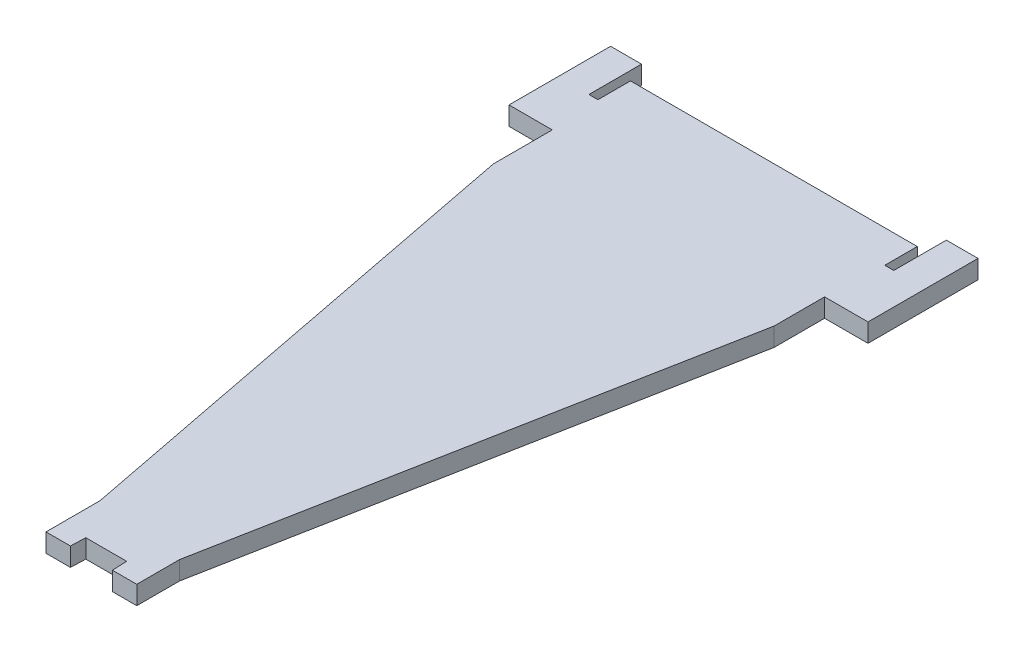
ISO-10303-21;
HEADER;
FILE_DESCRIPTION(('STEP AP214'),'2;1');
FILE_NAME('part.step','',(''),(''),'','','');
FILE_SCHEMA(('AUTOMOTIVE_DESIGN { 1 0 10303 214 1 1 1 1 }'));
ENDSEC;
DATA;
#1=APPLICATION_CONTEXT('core data for automotive mechanical design processes');
#2=APPLICATION_PROTOCOL_DEFINITION('international standard','automotive_design',2000,#1);
#3=PRODUCT_CONTEXT('',#1,'mechanical');
#4=PRODUCT('Part','Part','',(#3));
#5=PRODUCT_RELATED_PRODUCT_CATEGORY('part','',(#4));
#6=PRODUCT_DEFINITION_FORMATION('','',#4);
#7=PRODUCT_DEFINITION_CONTEXT('part definition',#1,'design');
#8=PRODUCT_DEFINITION('design','',#6,#7);
#9=PRODUCT_DEFINITION_SHAPE('','',#8);
#10=(LENGTH_UNIT() NAMED_UNIT(*) SI_UNIT(.MILLI.,.METRE.));
#11=(NAMED_UNIT(*) PLANE_ANGLE_UNIT() SI_UNIT($,.RADIAN.));
#12=(NAMED_UNIT(*) SI_UNIT($,.STERADIAN.) SOLID_ANGLE_UNIT());
#13=UNCERTAINTY_MEASURE_WITH_UNIT(LENGTH_MEASURE(1.E-05),#10,'distance_accuracy_value','');
#14=(GEOMETRIC_REPRESENTATION_CONTEXT(3) GLOBAL_UNCERTAINTY_ASSIGNED_CONTEXT((#13)) GLOBAL_UNIT_ASSIGNED_CONTEXT((#10,
#11,#12)) REPRESENTATION_CONTEXT('',''));
#15=CARTESIAN_POINT('',(0.,0.,0.));
#16=DIRECTION('',(0.,0.,1.));
#17=DIRECTION('',(1.,0.,0.));
#18=AXIS2_PLACEMENT_3D('',#15,#16,#17);
#19=CARTESIAN_POINT('',(65.7711044655571,0.35,-122.780144878676));
#20=DIRECTION('',(-1.,0.,0.));
#21=DIRECTION('',(0.,0.,1.));
#22=AXIS2_PLACEMENT_3D('',#19,#20,#21);
#23=PLANE('',#22);
#24=DIRECTION('',(0.,0.,-1.));
#25=VECTOR('',#24,1.);
#26=CARTESIAN_POINT('',(65.7711044655571,0.,-122.780144878676));
#27=LINE('',#26,#25);
#28=CARTESIAN_POINT('',(65.7711044655571,0.,-122.780144878676));
#29=VERTEX_POINT('',#28);
#30=CARTESIAN_POINT('',(65.7711044655571,0.,-123.588230371772));
#31=VERTEX_POINT('',#30);
#32=EDGE_CURVE('E226',#29,#31,#27,.T.);
#33=ORIENTED_EDGE('',*,*,#32,.T.);
#34=DIRECTION('',(0.,-1.,0.));
#35=VECTOR('',#34,1.);
#36=CARTESIAN_POINT('',(65.7711044655571,0.35,-123.588230371772));
#37=LINE('',#36,#35);
#38=CARTESIAN_POINT('',(65.7711044655571,0.35,-123.588230371772));
#39=VERTEX_POINT('',#38);
#40=EDGE_CURVE('E11',#39,#31,#37,.T.);
#41=ORIENTED_EDGE('',*,*,#40,.F.);
#42=DIRECTION('',(0.,0.,-1.));
#43=VECTOR('',#42,1.);
#44=CARTESIAN_POINT('',(65.7711044655571,0.35,-122.780144878676));
#45=LINE('',#44,#43);
#46=CARTESIAN_POINT('',(65.7711044655571,0.35,-122.780144878676));
#47=VERTEX_POINT('',#46);
#48=EDGE_CURVE('E272',#47,#39,#45,.T.);
#49=ORIENTED_EDGE('',*,*,#48,.F.);
#50=DIRECTION('',(0.,-1.,0.));
#51=VECTOR('',#50,1.);
#52=CARTESIAN_POINT('',(65.7711044655571,0.35,-122.780144878676));
#53=LINE('',#52,#51);
#54=EDGE_CURVE('E222',#47,#29,#53,.T.);
#55=ORIENTED_EDGE('',*,*,#54,.T.);
#56=EDGE_LOOP('',(#33,#41,#49,#55));
#57=FACE_BOUND('',#56,.T.);
#58=ADVANCED_FACE('F34',(#57),#23,.F.);
#59=CARTESIAN_POINT('',(65.7711044655571,0.35,-123.588230371772));
#60=DIRECTION('',(-0.98238526707992,0.,-0.186866762759767));
#61=DIRECTION('',(-0.186866762759767,0.,0.98238526707992));
#62=AXIS2_PLACEMENT_3D('',#59,#60,#61);
#63=PLANE('',#62);
#64=DIRECTION('',(0.186866762759767,0.,-0.98238526707992));
#65=VECTOR('',#64,1.);
#66=CARTESIAN_POINT('',(65.7711044655571,0.,-123.588230371772));
#67=LINE('',#66,#65);
#68=CARTESIAN_POINT('',(67.5611044655572,0.,-132.998516086058));
#69=VERTEX_POINT('',#68);
#70=EDGE_CURVE('E229',#31,#69,#67,.T.);
#71=ORIENTED_EDGE('',*,*,#70,.T.);
#72=DIRECTION('',(0.,-1.,0.));
#73=VECTOR('',#72,1.);
#74=CARTESIAN_POINT('',(67.5611044655572,0.35,-132.998516086058));
#75=LINE('',#74,#73);
#76=CARTESIAN_POINT('',(67.5611044655572,0.35,-132.998516086058));
#77=VERTEX_POINT('',#76);
#78=EDGE_CURVE('E42',#77,#69,#75,.T.);
#79=ORIENTED_EDGE('',*,*,#78,.F.);
#80=DIRECTION('',(0.186866762759767,0.,-0.98238526707992));
#81=VECTOR('',#80,1.);
#82=CARTESIAN_POINT('',(65.7711044655571,0.35,-123.588230371772));
#83=LINE('',#82,#81);
#84=EDGE_CURVE('E141',#39,#77,#83,.T.);
#85=ORIENTED_EDGE('',*,*,#84,.F.);
#86=ORIENTED_EDGE('',*,*,#40,.T.);
#87=EDGE_LOOP('',(#71,#79,#85,#86));
#88=FACE_BOUND('',#87,.T.);
#89=ADVANCED_FACE('F410',(#88),#63,.F.);
#90=CARTESIAN_POINT('',(67.5611044655572,0.35,-133.949859164384));
#91=DIRECTION('',(-1.,0.,0.));
#92=DIRECTION('',(0.,0.,1.));
#93=AXIS2_PLACEMENT_3D('',#90,#91,#92);
#94=PLANE('',#93);
#95=DIRECTION('',(0.,0.,-1.));
#96=VECTOR('',#95,1.);
#97=CARTESIAN_POINT('',(67.5611044655572,0.,-133.949859164384));
#98=LINE('',#97,#96);
#99=CARTESIAN_POINT('',(67.5611044655572,0.,-133.949859164384));
#100=VERTEX_POINT('',#99);
#101=EDGE_CURVE('E231',#69,#100,#98,.T.);
#102=ORIENTED_EDGE('',*,*,#101,.T.);
#103=DIRECTION('',(0.,-1.,0.));
#104=VECTOR('',#103,1.);
#105=CARTESIAN_POINT('',(67.5611044655572,0.35,-133.949859164384));
#106=LINE('',#105,#104);
#107=CARTESIAN_POINT('',(67.5611044655572,0.35,-133.949859164384));
#108=VERTEX_POINT('',#107);
#109=EDGE_CURVE('E327',#108,#100,#106,.T.);
#110=ORIENTED_EDGE('',*,*,#109,.F.);
#111=DIRECTION('',(0.,0.,-1.));
#112=VECTOR('',#111,1.);
#113=CARTESIAN_POINT('',(67.5611044655572,0.35,-133.949859164384));
#114=LINE('',#113,#112);
#115=EDGE_CURVE('E335',#77,#108,#114,.T.);
#116=ORIENTED_EDGE('',*,*,#115,.F.);
#117=ORIENTED_EDGE('',*,*,#78,.T.);
#118=EDGE_LOOP('',(#102,#110,#116,#117));
#119=FACE_BOUND('',#118,.T.);
#120=ADVANCED_FACE('F333',(#119),#94,.F.);
#121=CARTESIAN_POINT('',(67.5611044655572,0.35,-133.949859164384));
#122=DIRECTION('',(0.,0.,-1.));
#123=DIRECTION('',(-1.,0.,0.));
#124=AXIS2_PLACEMENT_3D('',#121,#122,#123);
#125=PLANE('',#124);
#126=DIRECTION('',(1.,0.,0.));
#127=VECTOR('',#126,1.);
#128=CARTESIAN_POINT('',(67.5611044655572,0.,-133.949859164384));
#129=LINE('',#128,#127);
#130=CARTESIAN_POINT('',(68.3785808872883,0.,-133.949859164384));
#131=VERTEX_POINT('',#130);
#132=EDGE_CURVE('E233',#100,#131,#129,.T.);
#133=ORIENTED_EDGE('',*,*,#132,.T.);
#134=DIRECTION('',(0.,-1.,0.));
#135=VECTOR('',#134,1.);
#136=CARTESIAN_POINT('',(68.3785808872883,0.35,-133.949859164384));
#137=LINE('',#136,#135);
#138=CARTESIAN_POINT('',(68.3785808872883,0.35,-133.949859164384));
#139=VERTEX_POINT('',#138);
#140=EDGE_CURVE('E324',#139,#131,#137,.T.);
#141=ORIENTED_EDGE('',*,*,#140,.F.);
#142=DIRECTION('',(1.,0.,0.));
#143=VECTOR('',#142,1.);
#144=CARTESIAN_POINT('',(67.5611044655572,0.35,-133.949859164384));
#145=LINE('',#144,#143);
#146=EDGE_CURVE('E353',#108,#139,#145,.T.);
#147=ORIENTED_EDGE('',*,*,#146,.F.);
#148=ORIENTED_EDGE('',*,*,#109,.T.);
#149=EDGE_LOOP('',(#133,#141,#147,#148));
#150=FACE_BOUND('',#149,.T.);
#151=ADVANCED_FACE('F344',(#150),#125,.F.);
#152=CARTESIAN_POINT('',(68.3785808872883,0.35,-136.022566647931));
#153=DIRECTION('',(-1.,0.,0.));
#154=DIRECTION('',(0.,0.,1.));
#155=AXIS2_PLACEMENT_3D('',#152,#153,#154);
#156=PLANE('',#155);
#157=DIRECTION('',(0.,0.,-1.));
#158=VECTOR('',#157,1.);
#159=CARTESIAN_POINT('',(68.3785808872883,0.,-136.022566647931));
#160=LINE('',#159,#158);
#161=CARTESIAN_POINT('',(68.3785808872883,0.,-136.022566647931));
#162=VERTEX_POINT('',#161);
#163=EDGE_CURVE('E235',#131,#162,#160,.T.);
#164=ORIENTED_EDGE('',*,*,#163,.T.);
#165=DIRECTION('',(0.,-1.,0.));
#166=VECTOR('',#165,1.);
#167=CARTESIAN_POINT('',(68.3785808872883,0.35,-136.022566647931));
#168=LINE('',#167,#166);
#169=CARTESIAN_POINT('',(68.3785808872883,0.35,-136.022566647931));
#170=VERTEX_POINT('',#169);
#171=EDGE_CURVE('E321',#170,#162,#168,.T.);
#172=ORIENTED_EDGE('',*,*,#171,.F.);
#173=DIRECTION('',(0.,0.,-1.));
#174=VECTOR('',#173,1.);
#175=CARTESIAN_POINT('',(68.3785808872883,0.35,-136.022566647931));
#176=LINE('',#175,#174);
#177=EDGE_CURVE('E350',#139,#170,#176,.T.);
#178=ORIENTED_EDGE('',*,*,#177,.F.);
#179=ORIENTED_EDGE('',*,*,#140,.T.);
#180=EDGE_LOOP('',(#164,#172,#178,#179));
#181=FACE_BOUND('',#180,.T.);
#182=ADVANCED_FACE('F348',(#181),#156,.F.);
#183=CARTESIAN_POINT('',(67.7824255223847,0.35,-136.022566647931));
#184=DIRECTION('',(0.,0.,1.));
#185=DIRECTION('',(1.,0.,0.));
#186=AXIS2_PLACEMENT_3D('',#183,#184,#185);
#187=PLANE('',#186);
#188=DIRECTION('',(-1.,0.,0.));
#189=VECTOR('',#188,1.);
#190=CARTESIAN_POINT('',(67.7824255223847,0.,-136.022566647931));
#191=LINE('',#190,#189);
#192=CARTESIAN_POINT('',(67.7824255223847,0.,-136.022566647931));
#193=VERTEX_POINT('',#192);
#194=EDGE_CURVE('E237',#162,#193,#191,.T.);
#195=ORIENTED_EDGE('',*,*,#194,.T.);
#196=DIRECTION('',(0.,-1.,0.));
#197=VECTOR('',#196,1.);
#198=CARTESIAN_POINT('',(67.7824255223847,0.35,-136.022566647931));
#199=LINE('',#198,#197);
#200=CARTESIAN_POINT('',(67.7824255223847,0.35,-136.022566647931));
#201=VERTEX_POINT('',#200);
#202=EDGE_CURVE('E318',#201,#193,#199,.T.);
#203=ORIENTED_EDGE('',*,*,#202,.F.);
#204=DIRECTION('',(-1.,0.,0.));
#205=VECTOR('',#204,1.);
#206=CARTESIAN_POINT('',(67.7824255223847,0.35,-136.022566647931));
#207=LINE('',#206,#205);
#208=EDGE_CURVE('E352',#170,#201,#207,.T.);
#209=ORIENTED_EDGE('',*,*,#208,.F.);
#210=ORIENTED_EDGE('',*,*,#171,.T.);
#211=EDGE_LOOP('',(#195,#203,#209,#210));
#212=FACE_BOUND('',#211,.T.);
#213=ADVANCED_FACE('F423',(#212),#187,.F.);
#214=CARTESIAN_POINT('',(67.7824255223847,0.35,-135.031947543574));
#215=DIRECTION('',(1.,0.,0.));
#216=DIRECTION('',(0.,0.,-1.));
#217=AXIS2_PLACEMENT_3D('',#214,#215,#216);
#218=PLANE('',#217);
#219=DIRECTION('',(0.,0.,1.));
#220=VECTOR('',#219,1.);
#221=CARTESIAN_POINT('',(67.7824255223847,0.,-135.031947543574));
#222=LINE('',#221,#220);
#223=CARTESIAN_POINT('',(67.7824255223847,0.,-135.031947543574));
#224=VERTEX_POINT('',#223);
#225=EDGE_CURVE('E239',#193,#224,#222,.T.);
#226=ORIENTED_EDGE('',*,*,#225,.T.);
#227=DIRECTION('',(0.,-1.,0.));
#228=VECTOR('',#227,1.);
#229=CARTESIAN_POINT('',(67.7824255223847,0.35,-135.031947543574));
#230=LINE('',#229,#228);
#231=CARTESIAN_POINT('',(67.7824255223847,0.35,-135.031947543574));
#232=VERTEX_POINT('',#231);
#233=EDGE_CURVE('E315',#232,#224,#230,.T.);
#234=ORIENTED_EDGE('',*,*,#233,.F.);
#235=DIRECTION('',(0.,0.,1.));
#236=VECTOR('',#235,1.);
#237=CARTESIAN_POINT('',(67.7824255223847,0.35,-135.031947543574));
#238=LINE('',#237,#236);
#239=EDGE_CURVE('E355',#201,#232,#238,.T.);
#240=ORIENTED_EDGE('',*,*,#239,.F.);
#241=ORIENTED_EDGE('',*,*,#202,.T.);
#242=EDGE_LOOP('',(#226,#234,#240,#241));
#243=FACE_BOUND('',#242,.T.);
#244=ADVANCED_FACE('F426',(#243),#218,.F.);
#245=CARTESIAN_POINT('',(67.6124255223847,0.35,-135.031947543574));
#246=DIRECTION('',(0.,0.,1.));
#247=DIRECTION('',(1.,0.,0.));
#248=AXIS2_PLACEMENT_3D('',#245,#246,#247);
#249=PLANE('',#248);
#250=DIRECTION('',(-1.,0.,0.));
#251=VECTOR('',#250,1.);
#252=CARTESIAN_POINT('',(67.6124255223847,0.,-135.031947543574));
#253=LINE('',#252,#251);
#254=CARTESIAN_POINT('',(67.6124255223847,0.,-135.031947543574));
#255=VERTEX_POINT('',#254);
#256=EDGE_CURVE('E241',#224,#255,#253,.T.);
#257=ORIENTED_EDGE('',*,*,#256,.T.);
#258=DIRECTION('',(0.,-1.,0.));
#259=VECTOR('',#258,1.);
#260=CARTESIAN_POINT('',(67.6124255223847,0.35,-135.031947543574));
#261=LINE('',#260,#259);
#262=CARTESIAN_POINT('',(67.6124255223847,0.35,-135.031947543574));
#263=VERTEX_POINT('',#262);
#264=EDGE_CURVE('E312',#263,#255,#261,.T.);
#265=ORIENTED_EDGE('',*,*,#264,.F.);
#266=DIRECTION('',(-1.,0.,0.));
#267=VECTOR('',#266,1.);
#268=CARTESIAN_POINT('',(67.6124255223847,0.35,-135.031947543574));
#269=LINE('',#268,#267);
#270=EDGE_CURVE('E361',#232,#263,#269,.T.);
#271=ORIENTED_EDGE('',*,*,#270,.F.);
#272=ORIENTED_EDGE('',*,*,#233,.T.);
#273=EDGE_LOOP('',(#257,#265,#271,#272));
#274=FACE_BOUND('',#273,.T.);
#275=ADVANCED_FACE('F430',(#274),#249,.F.);
#276=CARTESIAN_POINT('',(67.6124255223847,0.35,-135.644718333563));
#277=DIRECTION('',(-1.,0.,0.));
#278=DIRECTION('',(0.,0.,1.));
#279=AXIS2_PLACEMENT_3D('',#276,#277,#278);
#280=PLANE('',#279);
#281=DIRECTION('',(0.,0.,-1.));
#282=VECTOR('',#281,1.);
#283=CARTESIAN_POINT('',(67.6124255223847,0.,-135.644718333563));
#284=LINE('',#283,#282);
#285=CARTESIAN_POINT('',(67.6124255223847,0.,-135.644718333563));
#286=VERTEX_POINT('',#285);
#287=EDGE_CURVE('E243',#255,#286,#284,.T.);
#288=ORIENTED_EDGE('',*,*,#287,.T.);
#289=DIRECTION('',(0.,-1.,0.));
#290=VECTOR('',#289,1.);
#291=CARTESIAN_POINT('',(67.6124255223847,0.35,-135.644718333563));
#292=LINE('',#291,#290);
#293=CARTESIAN_POINT('',(67.6124255223847,0.35,-135.644718333563));
#294=VERTEX_POINT('',#293);
#295=EDGE_CURVE('E309',#294,#286,#292,.T.);
#296=ORIENTED_EDGE('',*,*,#295,.F.);
#297=DIRECTION('',(0.,0.,-1.));
#298=VECTOR('',#297,1.);
#299=CARTESIAN_POINT('',(67.6124255223847,0.35,-135.644718333563));
#300=LINE('',#299,#298);
#301=EDGE_CURVE('E363',#263,#294,#300,.T.);
#302=ORIENTED_EDGE('',*,*,#301,.F.);
#303=ORIENTED_EDGE('',*,*,#264,.T.);
#304=EDGE_LOOP('',(#288,#296,#302,#303));
#305=FACE_BOUND('',#304,.T.);
#306=ADVANCED_FACE('F434',(#305),#280,.F.);
#307=CARTESIAN_POINT('',(62.2085808872936,0.35,-135.644718333563));
#308=DIRECTION('',(0.,0.,1.));
#309=DIRECTION('',(1.,0.,0.));
#310=AXIS2_PLACEMENT_3D('',#307,#308,#309);
#311=PLANE('',#310);
#312=DIRECTION('',(-1.,0.,0.));
#313=VECTOR('',#312,1.);
#314=CARTESIAN_POINT('',(62.2085808872936,0.,-135.644718333563));
#315=LINE('',#314,#313);
#316=CARTESIAN_POINT('',(62.2085808872936,0.,-135.644718333563));
#317=VERTEX_POINT('',#316);
#318=EDGE_CURVE('E245',#286,#317,#315,.T.);
#319=ORIENTED_EDGE('',*,*,#318,.T.);
#320=DIRECTION('',(0.,-1.,0.));
#321=VECTOR('',#320,1.);
#322=CARTESIAN_POINT('',(62.2085808872936,0.35,-135.644718333563));
#323=LINE('',#322,#321);
#324=CARTESIAN_POINT('',(62.2085808872936,0.35,-135.644718333563));
#325=VERTEX_POINT('',#324);
#326=EDGE_CURVE('E306',#325,#317,#323,.T.);
#327=ORIENTED_EDGE('',*,*,#326,.F.);
#328=DIRECTION('',(-1.,0.,0.));
#329=VECTOR('',#328,1.);
#330=CARTESIAN_POINT('',(62.2085808872936,0.35,-135.644718333563));
#331=LINE('',#330,#329);
#332=EDGE_CURVE('E365',#294,#325,#331,.T.);
#333=ORIENTED_EDGE('',*,*,#332,.F.);
#334=ORIENTED_EDGE('',*,*,#295,.T.);
#335=EDGE_LOOP('',(#319,#327,#333,#334));
#336=FACE_BOUND('',#335,.T.);
#337=ADVANCED_FACE('F438',(#336),#311,.F.);
#338=CARTESIAN_POINT('',(62.2085808872936,0.35,-135.031947543574));
#339=DIRECTION('',(1.,0.,0.));
#340=DIRECTION('',(0.,0.,-1.));
#341=AXIS2_PLACEMENT_3D('',#338,#339,#340);
#342=PLANE('',#341);
#343=DIRECTION('',(0.,0.,1.));
#344=VECTOR('',#343,1.);
#345=CARTESIAN_POINT('',(62.2085808872936,0.,-135.031947543574));
#346=LINE('',#345,#344);
#347=CARTESIAN_POINT('',(62.2085808872936,0.,-135.031947543574));
#348=VERTEX_POINT('',#347);
#349=EDGE_CURVE('E247',#317,#348,#346,.T.);
#350=ORIENTED_EDGE('',*,*,#349,.T.);
#351=DIRECTION('',(0.,-1.,0.));
#352=VECTOR('',#351,1.);
#353=CARTESIAN_POINT('',(62.2085808872936,0.35,-135.031947543574));
#354=LINE('',#353,#352);
#355=CARTESIAN_POINT('',(62.2085808872936,0.35,-135.031947543574));
#356=VERTEX_POINT('',#355);
#357=EDGE_CURVE('E303',#356,#348,#354,.T.);
#358=ORIENTED_EDGE('',*,*,#357,.F.);
#359=DIRECTION('',(0.,0.,1.));
#360=VECTOR('',#359,1.);
#361=CARTESIAN_POINT('',(62.2085808872936,0.35,-135.031947543574));
#362=LINE('',#361,#360);
#363=EDGE_CURVE('E367',#325,#356,#362,.T.);
#364=ORIENTED_EDGE('',*,*,#363,.F.);
#365=ORIENTED_EDGE('',*,*,#326,.T.);
#366=EDGE_LOOP('',(#350,#358,#364,#365));
#367=FACE_BOUND('',#366,.T.);
#368=ADVANCED_FACE('F442',(#367),#342,.F.);
#369=CARTESIAN_POINT('',(62.0385808872936,0.35,-135.031947543574));
#370=DIRECTION('',(0.,0.,1.));
#371=DIRECTION('',(1.,0.,0.));
#372=AXIS2_PLACEMENT_3D('',#369,#370,#371);
#373=PLANE('',#372);
#374=DIRECTION('',(-1.,0.,0.));
#375=VECTOR('',#374,1.);
#376=CARTESIAN_POINT('',(62.0385808872936,0.,-135.031947543574));
#377=LINE('',#376,#375);
#378=CARTESIAN_POINT('',(62.0385808872936,0.,-135.031947543574));
#379=VERTEX_POINT('',#378);
#380=EDGE_CURVE('E249',#348,#379,#377,.T.);
#381=ORIENTED_EDGE('',*,*,#380,.T.);
#382=DIRECTION('',(0.,-1.,0.));
#383=VECTOR('',#382,1.);
#384=CARTESIAN_POINT('',(62.0385808872936,0.35,-135.031947543574));
#385=LINE('',#384,#383);
#386=CARTESIAN_POINT('',(62.0385808872936,0.35,-135.031947543574));
#387=VERTEX_POINT('',#386);
#388=EDGE_CURVE('E300',#387,#379,#385,.T.);
#389=ORIENTED_EDGE('',*,*,#388,.F.);
#390=DIRECTION('',(-1.,0.,0.));
#391=VECTOR('',#390,1.);
#392=CARTESIAN_POINT('',(62.0385808872936,0.35,-135.031947543574));
#393=LINE('',#392,#391);
#394=EDGE_CURVE('E369',#356,#387,#393,.T.);
#395=ORIENTED_EDGE('',*,*,#394,.F.);
#396=ORIENTED_EDGE('',*,*,#357,.T.);
#397=EDGE_LOOP('',(#381,#389,#395,#396));
#398=FACE_BOUND('',#397,.T.);
#399=ADVANCED_FACE('F446',(#398),#373,.F.);
#400=CARTESIAN_POINT('',(62.0385808872936,0.35,-136.022566647931));
#401=DIRECTION('',(-1.,0.,0.));
#402=DIRECTION('',(0.,0.,1.));
#403=AXIS2_PLACEMENT_3D('',#400,#401,#402);
#404=PLANE('',#403);
#405=DIRECTION('',(0.,0.,-1.));
#406=VECTOR('',#405,1.);
#407=CARTESIAN_POINT('',(62.0385808872936,0.,-136.022566647931));
#408=LINE('',#407,#406);
#409=CARTESIAN_POINT('',(62.0385808872936,0.,-136.022566647931));
#410=VERTEX_POINT('',#409);
#411=EDGE_CURVE('E251',#379,#410,#408,.T.);
#412=ORIENTED_EDGE('',*,*,#411,.T.);
#413=DIRECTION('',(0.,-1.,0.));
#414=VECTOR('',#413,1.);
#415=CARTESIAN_POINT('',(62.0385808872936,0.35,-136.022566647931));
#416=LINE('',#415,#414);
#417=CARTESIAN_POINT('',(62.0385808872936,0.35,-136.022566647931));
#418=VERTEX_POINT('',#417);
#419=EDGE_CURVE('E297',#418,#410,#416,.T.);
#420=ORIENTED_EDGE('',*,*,#419,.F.);
#421=DIRECTION('',(0.,0.,-1.));
#422=VECTOR('',#421,1.);
#423=CARTESIAN_POINT('',(62.0385808872936,0.35,-136.022566647931));
#424=LINE('',#423,#422);
#425=EDGE_CURVE('E371',#387,#418,#424,.T.);
#426=ORIENTED_EDGE('',*,*,#425,.F.);
#427=ORIENTED_EDGE('',*,*,#388,.T.);
#428=EDGE_LOOP('',(#412,#420,#426,#427));
#429=FACE_BOUND('',#428,.T.);
#430=ADVANCED_FACE('F450',(#429),#404,.F.);
#431=CARTESIAN_POINT('',(61.4562031438935,0.35,-136.022566647931));
#432=DIRECTION('',(0.,0.,1.));
#433=DIRECTION('',(1.,0.,0.));
#434=AXIS2_PLACEMENT_3D('',#431,#432,#433);
#435=PLANE('',#434);
#436=DIRECTION('',(-1.,0.,0.));
#437=VECTOR('',#436,1.);
#438=CARTESIAN_POINT('',(61.4562031438935,0.,-136.022566647931));
#439=LINE('',#438,#437);
#440=CARTESIAN_POINT('',(61.4562031438935,0.,-136.022566647931));
#441=VERTEX_POINT('',#440);
#442=EDGE_CURVE('E253',#410,#441,#439,.T.);
#443=ORIENTED_EDGE('',*,*,#442,.T.);
#444=DIRECTION('',(0.,-1.,0.));
#445=VECTOR('',#444,1.);
#446=CARTESIAN_POINT('',(61.4562031438935,0.35,-136.022566647931));
#447=LINE('',#446,#445);
#448=CARTESIAN_POINT('',(61.4562031438935,0.35,-136.022566647931));
#449=VERTEX_POINT('',#448);
#450=EDGE_CURVE('E294',#449,#441,#447,.T.);
#451=ORIENTED_EDGE('',*,*,#450,.F.);
#452=DIRECTION('',(-1.,0.,0.));
#453=VECTOR('',#452,1.);
#454=CARTESIAN_POINT('',(61.4562031438935,0.35,-136.022566647931));
#455=LINE('',#454,#453);
#456=EDGE_CURVE('E373',#418,#449,#455,.T.);
#457=ORIENTED_EDGE('',*,*,#456,.F.);
#458=ORIENTED_EDGE('',*,*,#419,.T.);
#459=EDGE_LOOP('',(#443,#451,#457,#458));
#460=FACE_BOUND('',#459,.T.);
#461=ADVANCED_FACE('F454',(#460),#435,.F.);
#462=CARTESIAN_POINT('',(61.4562031438935,0.35,-136.022566647931));
#463=DIRECTION('',(1.,0.,0.));
#464=DIRECTION('',(0.,0.,-1.));
#465=AXIS2_PLACEMENT_3D('',#462,#463,#464);
#466=PLANE('',#465);
#467=DIRECTION('',(0.,0.,1.));
#468=VECTOR('',#467,1.);
#469=CARTESIAN_POINT('',(61.4562031438935,0.,-136.022566647931));
#470=LINE('',#469,#468);
#471=CARTESIAN_POINT('',(61.4562031438935,0.,-134.108516086058));
#472=VERTEX_POINT('',#471);
#473=EDGE_CURVE('E255',#441,#472,#470,.T.);
#474=ORIENTED_EDGE('',*,*,#473,.T.);
#475=DIRECTION('',(0.,-1.,0.));
#476=VECTOR('',#475,1.);
#477=CARTESIAN_POINT('',(61.4562031438935,0.35,-134.108516086058));
#478=LINE('',#477,#476);
#479=CARTESIAN_POINT('',(61.4562031438935,0.35,-134.108516086058));
#480=VERTEX_POINT('',#479);
#481=EDGE_CURVE('E291',#480,#472,#478,.T.);
#482=ORIENTED_EDGE('',*,*,#481,.F.);
#483=DIRECTION('',(0.,0.,1.));
#484=VECTOR('',#483,1.);
#485=CARTESIAN_POINT('',(61.4562031438935,0.35,-136.022566647931));
#486=LINE('',#485,#484);
#487=EDGE_CURVE('E375',#449,#480,#486,.T.);
#488=ORIENTED_EDGE('',*,*,#487,.F.);
#489=ORIENTED_EDGE('',*,*,#450,.T.);
#490=EDGE_LOOP('',(#474,#482,#488,#489));
#491=FACE_BOUND('',#490,.T.);
#492=ADVANCED_FACE('F458',(#491),#466,.F.);
#493=CARTESIAN_POINT('',(61.4562031438935,0.35,-134.108516086058));
#494=DIRECTION('',(0.,0.,-1.));
#495=DIRECTION('',(-1.,0.,0.));
#496=AXIS2_PLACEMENT_3D('',#493,#494,#495);
#497=PLANE('',#496);
#498=DIRECTION('',(1.,0.,0.));
#499=VECTOR('',#498,1.);
#500=CARTESIAN_POINT('',(61.4562031438935,0.,-134.108516086058));
#501=LINE('',#500,#499);
#502=CARTESIAN_POINT('',(62.2711044655562,0.,-134.108516086058));
#503=VERTEX_POINT('',#502);
#504=EDGE_CURVE('E257',#472,#503,#501,.T.);
#505=ORIENTED_EDGE('',*,*,#504,.T.);
#506=DIRECTION('',(0.,-1.,0.));
#507=VECTOR('',#506,1.);
#508=CARTESIAN_POINT('',(62.2711044655562,0.35,-134.108516086058));
#509=LINE('',#508,#507);
#510=CARTESIAN_POINT('',(62.2711044655562,0.35,-134.108516086058));
#511=VERTEX_POINT('',#510);
#512=EDGE_CURVE('E288',#511,#503,#509,.T.);
#513=ORIENTED_EDGE('',*,*,#512,.F.);
#514=DIRECTION('',(1.,0.,0.));
#515=VECTOR('',#514,1.);
#516=CARTESIAN_POINT('',(61.4562031438935,0.35,-134.108516086058));
#517=LINE('',#516,#515);
#518=EDGE_CURVE('E377',#480,#511,#517,.T.);
#519=ORIENTED_EDGE('',*,*,#518,.F.);
#520=ORIENTED_EDGE('',*,*,#481,.T.);
#521=EDGE_LOOP('',(#505,#513,#519,#520));
#522=FACE_BOUND('',#521,.T.);
#523=ADVANCED_FACE('F462',(#522),#497,.F.);
#524=CARTESIAN_POINT('',(62.2711044655562,0.35,-132.998516086058));
#525=DIRECTION('',(1.,0.,0.));
#526=DIRECTION('',(0.,0.,-1.));
#527=AXIS2_PLACEMENT_3D('',#524,#525,#526);
#528=PLANE('',#527);
#529=DIRECTION('',(0.,0.,1.));
#530=VECTOR('',#529,1.);
#531=CARTESIAN_POINT('',(62.2711044655562,0.,-132.998516086058));
#532=LINE('',#531,#530);
#533=CARTESIAN_POINT('',(62.2711044655562,0.,-132.998516086058));
#534=VERTEX_POINT('',#533);
#535=EDGE_CURVE('E259',#503,#534,#532,.T.);
#536=ORIENTED_EDGE('',*,*,#535,.T.);
#537=DIRECTION('',(0.,-1.,0.));
#538=VECTOR('',#537,1.);
#539=CARTESIAN_POINT('',(62.2711044655562,0.35,-132.998516086058));
#540=LINE('',#539,#538);
#541=CARTESIAN_POINT('',(62.2711044655562,0.35,-132.998516086058));
#542=VERTEX_POINT('',#541);
#543=EDGE_CURVE('E285',#542,#534,#540,.T.);
#544=ORIENTED_EDGE('',*,*,#543,.F.);
#545=DIRECTION('',(0.,0.,1.));
#546=VECTOR('',#545,1.);
#547=CARTESIAN_POINT('',(62.2711044655562,0.35,-132.998516086058));
#548=LINE('',#547,#546);
#549=EDGE_CURVE('E379',#511,#542,#548,.T.);
#550=ORIENTED_EDGE('',*,*,#549,.F.);
#551=ORIENTED_EDGE('',*,*,#512,.T.);
#552=EDGE_LOOP('',(#536,#544,#550,#551));
#553=FACE_BOUND('',#552,.T.);
#554=ADVANCED_FACE('F466',(#553),#528,.F.);
#555=CARTESIAN_POINT('',(62.2711044655562,0.35,-132.998516086058));
#556=DIRECTION('',(0.981593171442244,0.,-0.19098388879159));
#557=DIRECTION('',(-0.19098388879159,0.,-0.981593171442244));
#558=AXIS2_PLACEMENT_3D('',#555,#556,#557);
#559=PLANE('',#558);
#560=DIRECTION('',(0.19098388879159,0.,0.981593171442244));
#561=VECTOR('',#560,1.);
#562=CARTESIAN_POINT('',(62.2711044655562,0.,-132.998516086058));
#563=LINE('',#562,#561);
#564=CARTESIAN_POINT('',(64.0611044655572,0.,-123.798516086058));
#565=VERTEX_POINT('',#564);
#566=EDGE_CURVE('E261',#534,#565,#563,.T.);
#567=ORIENTED_EDGE('',*,*,#566,.T.);
#568=DIRECTION('',(0.,-1.,0.));
#569=VECTOR('',#568,1.);
#570=CARTESIAN_POINT('',(64.0611044655572,0.35,-123.798516086058));
#571=LINE('',#570,#569);
#572=CARTESIAN_POINT('',(64.0611044655572,0.35,-123.798516086058));
#573=VERTEX_POINT('',#572);
#574=EDGE_CURVE('E282',#573,#565,#571,.T.);
#575=ORIENTED_EDGE('',*,*,#574,.F.);
#576=DIRECTION('',(0.19098388879159,0.,0.981593171442244));
#577=VECTOR('',#576,1.);
#578=CARTESIAN_POINT('',(62.2711044655562,0.35,-132.998516086058));
#579=LINE('',#578,#577);
#580=EDGE_CURVE('E381',#542,#573,#579,.T.);
#581=ORIENTED_EDGE('',*,*,#580,.F.);
#582=ORIENTED_EDGE('',*,*,#543,.T.);
#583=EDGE_LOOP('',(#567,#575,#581,#582));
#584=FACE_BOUND('',#583,.T.);
#585=ADVANCED_FACE('F470',(#584),#559,.F.);
#586=CARTESIAN_POINT('',(64.0611044655572,0.35,-123.798516086058));
#587=DIRECTION('',(1.,0.,0.));
#588=DIRECTION('',(0.,0.,-1.));
#589=AXIS2_PLACEMENT_3D('',#586,#587,#588);
#590=PLANE('',#589);
#591=DIRECTION('',(0.,0.,1.));
#592=VECTOR('',#591,1.);
#593=CARTESIAN_POINT('',(64.0611044655572,0.,-123.798516086058));
#594=LINE('',#593,#592);
#595=CARTESIAN_POINT('',(64.0611044655572,0.,-122.780144878676));
#596=VERTEX_POINT('',#595);
#597=EDGE_CURVE('E263',#565,#596,#594,.T.);
#598=ORIENTED_EDGE('',*,*,#597,.T.);
#599=DIRECTION('',(0.,-1.,0.));
#600=VECTOR('',#599,1.);
#601=CARTESIAN_POINT('',(64.0611044655572,0.35,-122.780144878676));
#602=LINE('',#601,#600);
#603=CARTESIAN_POINT('',(64.0611044655572,0.35,-122.780144878676));
#604=VERTEX_POINT('',#603);
#605=EDGE_CURVE('E279',#604,#596,#602,.T.);
#606=ORIENTED_EDGE('',*,*,#605,.F.);
#607=DIRECTION('',(0.,0.,1.));
#608=VECTOR('',#607,1.);
#609=CARTESIAN_POINT('',(64.0611044655572,0.35,-123.798516086058));
#610=LINE('',#609,#608);
#611=EDGE_CURVE('E383',#573,#604,#610,.T.);
#612=ORIENTED_EDGE('',*,*,#611,.F.);
#613=ORIENTED_EDGE('',*,*,#574,.T.);
#614=EDGE_LOOP('',(#598,#606,#612,#613));
#615=FACE_BOUND('',#614,.T.);
#616=ADVANCED_FACE('F474',(#615),#590,.F.);
#617=CARTESIAN_POINT('',(64.0611044655572,0.35,-122.780144878676));
#618=DIRECTION('',(0.,0.,-1.));
#619=DIRECTION('',(-1.,0.,0.));
#620=AXIS2_PLACEMENT_3D('',#617,#618,#619);
#621=PLANE('',#620);
#622=DIRECTION('',(1.,0.,0.));
#623=VECTOR('',#622,1.);
#624=CARTESIAN_POINT('',(64.0611044655572,0.,-122.780144878676));
#625=LINE('',#624,#623);
#626=CARTESIAN_POINT('',(64.5211044655571,0.,-122.780144878676));
#627=VERTEX_POINT('',#626);
#628=EDGE_CURVE('E265',#596,#627,#625,.T.);
#629=ORIENTED_EDGE('',*,*,#628,.T.);
#630=DIRECTION('',(0.,-1.,0.));
#631=VECTOR('',#630,1.);
#632=CARTESIAN_POINT('',(64.5211044655571,0.35,-122.780144878676));
#633=LINE('',#632,#631);
#634=CARTESIAN_POINT('',(64.5211044655571,0.35,-122.780144878676));
#635=VERTEX_POINT('',#634);
#636=EDGE_CURVE('E276',#635,#627,#633,.T.);
#637=ORIENTED_EDGE('',*,*,#636,.F.);
#638=DIRECTION('',(1.,0.,0.));
#639=VECTOR('',#638,1.);
#640=CARTESIAN_POINT('',(64.0611044655572,0.35,-122.780144878676));
#641=LINE('',#640,#639);
#642=EDGE_CURVE('E385',#604,#635,#641,.T.);
#643=ORIENTED_EDGE('',*,*,#642,.F.);
#644=ORIENTED_EDGE('',*,*,#605,.T.);
#645=EDGE_LOOP('',(#629,#637,#643,#644));
#646=FACE_BOUND('',#645,.T.);
#647=ADVANCED_FACE('F391',(#646),#621,.F.);
#648=CARTESIAN_POINT('',(64.5211044655571,0.35,-122.780144878676));
#649=DIRECTION('',(-0.999362854347559,0.,-0.0356915305121422));
#650=DIRECTION('',(-0.0356915305121422,0.,0.999362854347559));
#651=AXIS2_PLACEMENT_3D('',#648,#649,#650);
#652=PLANE('',#651);
#653=DIRECTION('',(0.0356915305121422,0.,-0.999362854347559));
#654=VECTOR('',#653,1.);
#655=CARTESIAN_POINT('',(64.5211044655571,0.,-122.780144878676));
#656=LINE('',#655,#654);
#657=CARTESIAN_POINT('',(64.5311044655571,0.,-123.060144878678));
#658=VERTEX_POINT('',#657);
#659=EDGE_CURVE('E267',#627,#658,#656,.T.);
#660=ORIENTED_EDGE('',*,*,#659,.T.);
#661=DIRECTION('',(0.,-1.,0.));
#662=VECTOR('',#661,1.);
#663=CARTESIAN_POINT('',(64.5311044655571,0.35,-123.060144878678));
#664=LINE('',#663,#662);
#665=CARTESIAN_POINT('',(64.5311044655571,0.35,-123.060144878678));
#666=VERTEX_POINT('',#665);
#667=EDGE_CURVE('E217',#666,#658,#664,.T.);
#668=ORIENTED_EDGE('',*,*,#667,.F.);
#669=DIRECTION('',(0.0356915305121422,0.,-0.999362854347559));
#670=VECTOR('',#669,1.);
#671=CARTESIAN_POINT('',(64.5211044655571,0.35,-122.780144878676));
#672=LINE('',#671,#670);
#673=EDGE_CURVE('E208',#635,#666,#672,.T.);
#674=ORIENTED_EDGE('',*,*,#673,.F.);
#675=ORIENTED_EDGE('',*,*,#636,.T.);
#676=EDGE_LOOP('',(#660,#668,#674,#675));
#677=FACE_BOUND('',#676,.T.);
#678=ADVANCED_FACE('F395',(#677),#652,.F.);
#679=CARTESIAN_POINT('',(64.5311044655571,0.35,-123.060144878678));
#680=DIRECTION('',(0.,0.,-1.));
#681=DIRECTION('',(-1.,0.,0.));
#682=AXIS2_PLACEMENT_3D('',#679,#680,#681);
#683=PLANE('',#682);
#684=DIRECTION('',(1.,0.,0.));
#685=VECTOR('',#684,1.);
#686=CARTESIAN_POINT('',(64.5311044655571,0.,-123.060144878678));
#687=LINE('',#686,#685);
#688=CARTESIAN_POINT('',(65.3011044655571,0.,-123.060144878678));
#689=VERTEX_POINT('',#688);
#690=EDGE_CURVE('E216',#658,#689,#687,.T.);
#691=ORIENTED_EDGE('',*,*,#690,.T.);
#692=DIRECTION('',(0.,-1.,0.));
#693=VECTOR('',#692,1.);
#694=CARTESIAN_POINT('',(65.3011044655571,0.35,-123.060144878678));
#695=LINE('',#694,#693);
#696=CARTESIAN_POINT('',(65.3011044655571,0.35,-123.060144878678));
#697=VERTEX_POINT('',#696);
#698=EDGE_CURVE('E213',#697,#689,#695,.T.);
#699=ORIENTED_EDGE('',*,*,#698,.F.);
#700=DIRECTION('',(1.,0.,0.));
#701=VECTOR('',#700,1.);
#702=CARTESIAN_POINT('',(64.5311044655571,0.35,-123.060144878678));
#703=LINE('',#702,#701);
#704=EDGE_CURVE('E202',#666,#697,#703,.T.);
#705=ORIENTED_EDGE('',*,*,#704,.F.);
#706=ORIENTED_EDGE('',*,*,#667,.T.);
#707=EDGE_LOOP('',(#691,#699,#705,#706));
#708=FACE_BOUND('',#707,.T.);
#709=ADVANCED_FACE('F214',(#708),#683,.F.);
#710=CARTESIAN_POINT('',(65.3011044655571,0.35,-123.060144878678));
#711=DIRECTION('',(0.999362854347561,0.,-0.0356915305120927));
#712=DIRECTION('',(-0.0356915305120927,0.,-0.999362854347561));
#713=AXIS2_PLACEMENT_3D('',#710,#711,#712);
#714=PLANE('',#713);
#715=DIRECTION('',(0.0356915305120927,0.,0.999362854347561));
#716=VECTOR('',#715,1.);
#717=CARTESIAN_POINT('',(65.3011044655571,0.,-123.060144878678));
#718=LINE('',#717,#716);
#719=CARTESIAN_POINT('',(65.3111044655571,0.,-122.780144878676));
#720=VERTEX_POINT('',#719);
#721=EDGE_CURVE('E127',#689,#720,#718,.T.);
#722=ORIENTED_EDGE('',*,*,#721,.T.);
#723=DIRECTION('',(0.,-1.,0.));
#724=VECTOR('',#723,1.);
#725=CARTESIAN_POINT('',(65.3111044655571,0.35,-122.780144878676));
#726=LINE('',#725,#724);
#727=CARTESIAN_POINT('',(65.3111044655571,0.35,-122.780144878676));
#728=VERTEX_POINT('',#727);
#729=EDGE_CURVE('E218',#728,#720,#726,.T.);
#730=ORIENTED_EDGE('',*,*,#729,.F.);
#731=DIRECTION('',(0.0356915305120927,0.,0.999362854347561));
#732=VECTOR('',#731,1.);
#733=CARTESIAN_POINT('',(65.3011044655571,0.35,-123.060144878678));
#734=LINE('',#733,#732);
#735=EDGE_CURVE('E206',#697,#728,#734,.T.);
#736=ORIENTED_EDGE('',*,*,#735,.F.);
#737=ORIENTED_EDGE('',*,*,#698,.T.);
#738=EDGE_LOOP('',(#722,#730,#736,#737));
#739=FACE_BOUND('',#738,.T.);
#740=ADVANCED_FACE('F220',(#739),#714,.F.);
#741=CARTESIAN_POINT('',(65.3111044655571,0.35,-122.780144878676));
#742=DIRECTION('',(0.,0.,-1.));
#743=DIRECTION('',(-1.,0.,0.));
#744=AXIS2_PLACEMENT_3D('',#741,#742,#743);
#745=PLANE('',#744);
#746=DIRECTION('',(1.,0.,0.));
#747=VECTOR('',#746,1.);
#748=CARTESIAN_POINT('',(65.3111044655571,0.,-122.780144878676));
#749=LINE('',#748,#747);
#750=EDGE_CURVE('E133',#720,#29,#749,.T.);
#751=ORIENTED_EDGE('',*,*,#750,.T.);
#752=ORIENTED_EDGE('',*,*,#54,.F.);
#753=DIRECTION('',(1.,0.,0.));
#754=VECTOR('',#753,1.);
#755=CARTESIAN_POINT('',(65.3111044655571,0.35,-122.780144878676));
#756=LINE('',#755,#754);
#757=EDGE_CURVE('E50',#728,#47,#756,.T.);
#758=ORIENTED_EDGE('',*,*,#757,.F.);
#759=ORIENTED_EDGE('',*,*,#729,.T.);
#760=EDGE_LOOP('',(#751,#752,#758,#759));
#761=FACE_BOUND('',#760,.T.);
#762=ADVANCED_FACE('F399',(#761),#745,.F.);
#763=CARTESIAN_POINT('',(0.,0.35,0.));
#764=DIRECTION('',(0.,-1.,0.));
#765=DIRECTION('',(0.,0.,-1.));
#766=AXIS2_PLACEMENT_3D('',#763,#764,#765);
#767=PLANE('',#766);
#768=ORIENTED_EDGE('',*,*,#48,.T.);
#769=ORIENTED_EDGE('',*,*,#84,.T.);
#770=ORIENTED_EDGE('',*,*,#115,.T.);
#771=ORIENTED_EDGE('',*,*,#146,.T.);
#772=ORIENTED_EDGE('',*,*,#177,.T.);
#773=ORIENTED_EDGE('',*,*,#208,.T.);
#774=ORIENTED_EDGE('',*,*,#239,.T.);
#775=ORIENTED_EDGE('',*,*,#270,.T.);
#776=ORIENTED_EDGE('',*,*,#301,.T.);
#777=ORIENTED_EDGE('',*,*,#332,.T.);
#778=ORIENTED_EDGE('',*,*,#363,.T.);
#779=ORIENTED_EDGE('',*,*,#394,.T.);
#780=ORIENTED_EDGE('',*,*,#425,.T.);
#781=ORIENTED_EDGE('',*,*,#456,.T.);
#782=ORIENTED_EDGE('',*,*,#487,.T.);
#783=ORIENTED_EDGE('',*,*,#518,.T.);
#784=ORIENTED_EDGE('',*,*,#549,.T.);
#785=ORIENTED_EDGE('',*,*,#580,.T.);
#786=ORIENTED_EDGE('',*,*,#611,.T.);
#787=ORIENTED_EDGE('',*,*,#642,.T.);
#788=ORIENTED_EDGE('',*,*,#673,.T.);
#789=ORIENTED_EDGE('',*,*,#704,.T.);
#790=ORIENTED_EDGE('',*,*,#735,.T.);
#791=ORIENTED_EDGE('',*,*,#757,.T.);
#792=EDGE_LOOP('',(#768,#769,#770,#771,#772,#773,#774,#775,#776,#777,#778,#779,#780,#781,#782,
#783,#784,#785,#786,#787,#788,#789,#790,#791));
#793=FACE_BOUND('',#792,.T.);
#794=ADVANCED_FACE('F204',(#793),#767,.F.);
#795=CARTESIAN_POINT('',(0.,0.,0.));
#796=DIRECTION('',(0.,-1.,0.));
#797=DIRECTION('',(0.,0.,-1.));
#798=AXIS2_PLACEMENT_3D('',#795,#796,#797);
#799=PLANE('',#798);
#800=ORIENTED_EDGE('',*,*,#32,.F.);
#801=ORIENTED_EDGE('',*,*,#750,.F.);
#802=ORIENTED_EDGE('',*,*,#721,.F.);
#803=ORIENTED_EDGE('',*,*,#690,.F.);
#804=ORIENTED_EDGE('',*,*,#659,.F.);
#805=ORIENTED_EDGE('',*,*,#628,.F.);
#806=ORIENTED_EDGE('',*,*,#597,.F.);
#807=ORIENTED_EDGE('',*,*,#566,.F.);
#808=ORIENTED_EDGE('',*,*,#535,.F.);
#809=ORIENTED_EDGE('',*,*,#504,.F.);
#810=ORIENTED_EDGE('',*,*,#473,.F.);
#811=ORIENTED_EDGE('',*,*,#442,.F.);
#812=ORIENTED_EDGE('',*,*,#411,.F.);
#813=ORIENTED_EDGE('',*,*,#380,.F.);
#814=ORIENTED_EDGE('',*,*,#349,.F.);
#815=ORIENTED_EDGE('',*,*,#318,.F.);
#816=ORIENTED_EDGE('',*,*,#287,.F.);
#817=ORIENTED_EDGE('',*,*,#256,.F.);
#818=ORIENTED_EDGE('',*,*,#225,.F.);
#819=ORIENTED_EDGE('',*,*,#194,.F.);
#820=ORIENTED_EDGE('',*,*,#163,.F.);
#821=ORIENTED_EDGE('',*,*,#132,.F.);
#822=ORIENTED_EDGE('',*,*,#101,.F.);
#823=ORIENTED_EDGE('',*,*,#70,.F.);
#824=EDGE_LOOP('',(#800,#801,#802,#803,#804,#805,#806,#807,#808,#809,#810,#811,#812,#813,#814,
#815,#816,#817,#818,#819,#820,#821,#822,#823));
#825=FACE_BOUND('',#824,.T.);
#826=ADVANCED_FACE('F339',(#825),#799,.T.);
#827=CLOSED_SHELL('',(#58,#89,#120,#151,#182,#213,#244,#275,#306,#337,#368,#399,#430,#461,#492,
#523,#554,#585,#616,#647,#678,#709,#740,#762,#794,#826));
#828=MANIFOLD_SOLID_BREP('B2',#827);
#829=ADVANCED_BREP_SHAPE_REPRESENTATION('',(#18,#828),#14);
#830=SHAPE_DEFINITION_REPRESENTATION(#9,#829);
ENDSEC;
END-ISO-10303-21;
